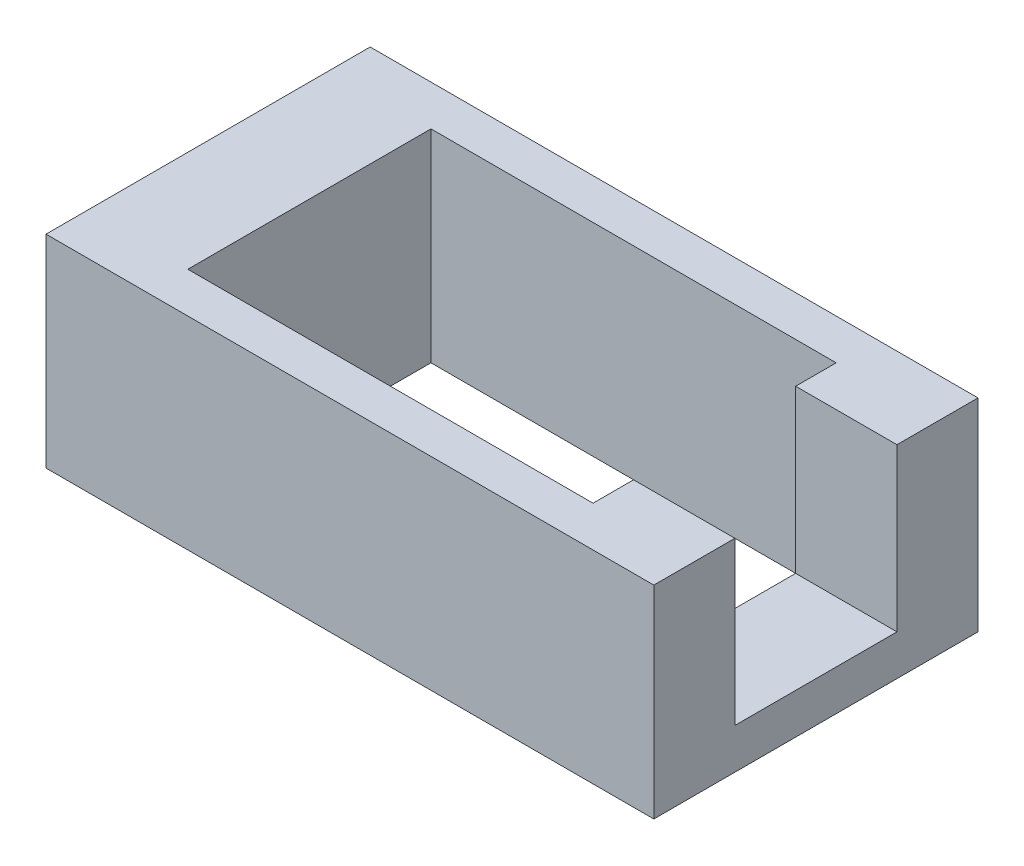
ISO-10303-21;
HEADER;
FILE_DESCRIPTION(('STEP AP214'),'2;1');
FILE_NAME('part.step','',(''),(''),'','','');
FILE_SCHEMA(('AUTOMOTIVE_DESIGN { 1 0 10303 214 1 1 1 1 }'));
ENDSEC;
DATA;
#1=APPLICATION_CONTEXT('core data for automotive mechanical design processes');
#2=APPLICATION_PROTOCOL_DEFINITION('international standard','automotive_design',2000,#1);
#3=PRODUCT_CONTEXT('',#1,'mechanical');
#4=PRODUCT('Part','Part','',(#3));
#5=PRODUCT_RELATED_PRODUCT_CATEGORY('part','',(#4));
#6=PRODUCT_DEFINITION_FORMATION('','',#4);
#7=PRODUCT_DEFINITION_CONTEXT('part definition',#1,'design');
#8=PRODUCT_DEFINITION('design','',#6,#7);
#9=PRODUCT_DEFINITION_SHAPE('','',#8);
#10=(LENGTH_UNIT() NAMED_UNIT(*) SI_UNIT(.MILLI.,.METRE.));
#11=(NAMED_UNIT(*) PLANE_ANGLE_UNIT() SI_UNIT($,.RADIAN.));
#12=(NAMED_UNIT(*) SI_UNIT($,.STERADIAN.) SOLID_ANGLE_UNIT());
#13=UNCERTAINTY_MEASURE_WITH_UNIT(LENGTH_MEASURE(1.E-05),#10,'distance_accuracy_value','');
#14=(GEOMETRIC_REPRESENTATION_CONTEXT(3) GLOBAL_UNCERTAINTY_ASSIGNED_CONTEXT((#13)) GLOBAL_UNIT_ASSIGNED_CONTEXT((#10,
#11,#12)) REPRESENTATION_CONTEXT('',''));
#15=CARTESIAN_POINT('',(0.,0.,0.));
#16=DIRECTION('',(0.,0.,1.));
#17=DIRECTION('',(1.,0.,0.));
#18=AXIS2_PLACEMENT_3D('',#15,#16,#17);
#19=CARTESIAN_POINT('',(0.,55.4278760968653,0.));
#20=DIRECTION('',(0.,1.,0.));
#21=DIRECTION('',(0.,0.,1.));
#22=AXIS2_PLACEMENT_3D('',#19,#20,#21);
#23=PLANE('',#22);
#24=DIRECTION('',(0.,0.,1.));
#25=VECTOR('',#24,1.);
#26=CARTESIAN_POINT('',(5.,55.4278760968653,-33.));
#27=LINE('',#26,#25);
#28=CARTESIAN_POINT('',(5.,55.4278760968653,-33.));
#29=VERTEX_POINT('',#28);
#30=CARTESIAN_POINT('',(5.,55.4278760968653,-32.));
#31=VERTEX_POINT('',#30);
#32=EDGE_CURVE('E242',#29,#31,#27,.T.);
#33=ORIENTED_EDGE('',*,*,#32,.T.);
#34=DIRECTION('',(1.,0.,0.));
#35=VECTOR('',#34,1.);
#36=CARTESIAN_POINT('',(2.5,55.4278760968653,-32.));
#37=LINE('',#36,#35);
#38=CARTESIAN_POINT('',(7.5,55.4278760968653,-32.));
#39=VERTEX_POINT('',#38);
#40=EDGE_CURVE('E47',#31,#39,#37,.T.);
#41=ORIENTED_EDGE('',*,*,#40,.T.);
#42=DIRECTION('',(0.,0.,1.));
#43=VECTOR('',#42,1.);
#44=CARTESIAN_POINT('',(7.5,55.4278760968653,-34.));
#45=LINE('',#44,#43);
#46=CARTESIAN_POINT('',(7.5,55.4278760968653,-34.));
#47=VERTEX_POINT('',#46);
#48=EDGE_CURVE('E243',#47,#39,#45,.T.);
#49=ORIENTED_EDGE('',*,*,#48,.F.);
#50=DIRECTION('',(1.,0.,0.));
#51=VECTOR('',#50,1.);
#52=CARTESIAN_POINT('',(-7.5,55.4278760968653,-34.));
#53=LINE('',#52,#51);
#54=CARTESIAN_POINT('',(-7.5,55.4278760968653,-34.));
#55=VERTEX_POINT('',#54);
#56=EDGE_CURVE('E235',#55,#47,#53,.T.);
#57=ORIENTED_EDGE('',*,*,#56,.F.);
#58=DIRECTION('',(0.,0.,-1.));
#59=VECTOR('',#58,1.);
#60=CARTESIAN_POINT('',(-7.5,55.4278760968653,-34.));
#61=LINE('',#60,#59);
#62=CARTESIAN_POINT('',(-7.5,55.4278760968653,-26.));
#63=VERTEX_POINT('',#62);
#64=EDGE_CURVE('E65',#63,#55,#61,.T.);
#65=ORIENTED_EDGE('',*,*,#64,.F.);
#66=DIRECTION('',(-1.,0.,0.));
#67=VECTOR('',#66,1.);
#68=CARTESIAN_POINT('',(-7.5,55.4278760968653,-26.));
#69=LINE('',#68,#67);
#70=CARTESIAN_POINT('',(7.5,55.4278760968653,-26.));
#71=VERTEX_POINT('',#70);
#72=EDGE_CURVE('E60',#71,#63,#69,.T.);
#73=ORIENTED_EDGE('',*,*,#72,.F.);
#74=CARTESIAN_POINT('',(7.5,55.4278760968653,-28.));
#75=VERTEX_POINT('',#74);
#76=EDGE_CURVE('E246',#75,#71,#45,.T.);
#77=ORIENTED_EDGE('',*,*,#76,.F.);
#78=DIRECTION('',(-1.,0.,0.));
#79=VECTOR('',#78,1.);
#80=CARTESIAN_POINT('',(2.5,55.4278760968653,-28.));
#81=LINE('',#80,#79);
#82=CARTESIAN_POINT('',(5.,55.4278760968653,-28.));
#83=VERTEX_POINT('',#82);
#84=EDGE_CURVE('E12',#75,#83,#81,.T.);
#85=ORIENTED_EDGE('',*,*,#84,.T.);
#86=CARTESIAN_POINT('',(5.,55.4278760968653,-27.));
#87=VERTEX_POINT('',#86);
#88=EDGE_CURVE('E237',#83,#87,#27,.T.);
#89=ORIENTED_EDGE('',*,*,#88,.T.);
#90=DIRECTION('',(-1.,0.,0.));
#91=VECTOR('',#90,1.);
#92=CARTESIAN_POINT('',(-5.,55.4278760968653,-27.));
#93=LINE('',#92,#91);
#94=CARTESIAN_POINT('',(-5.,55.4278760968653,-27.));
#95=VERTEX_POINT('',#94);
#96=EDGE_CURVE('E241',#87,#95,#93,.T.);
#97=ORIENTED_EDGE('',*,*,#96,.T.);
#98=DIRECTION('',(0.,0.,-1.));
#99=VECTOR('',#98,1.);
#100=CARTESIAN_POINT('',(-5.,55.4278760968653,-33.));
#101=LINE('',#100,#99);
#102=CARTESIAN_POINT('',(-5.,55.4278760968653,-33.));
#103=VERTEX_POINT('',#102);
#104=EDGE_CURVE('E250',#95,#103,#101,.T.);
#105=ORIENTED_EDGE('',*,*,#104,.T.);
#106=DIRECTION('',(1.,0.,0.));
#107=VECTOR('',#106,1.);
#108=CARTESIAN_POINT('',(-5.,55.4278760968653,-33.));
#109=LINE('',#108,#107);
#110=EDGE_CURVE('E256',#103,#29,#109,.T.);
#111=ORIENTED_EDGE('',*,*,#110,.T.);
#112=EDGE_LOOP('',(#33,#41,#49,#57,#65,#73,#77,#85,#89,#97,#105,#111));
#113=FACE_BOUND('',#112,.T.);
#114=ADVANCED_FACE('F44',(#113),#23,.T.);
#115=CARTESIAN_POINT('',(-7.5,50.4278760968653,-26.));
#116=DIRECTION('',(0.,0.,1.));
#117=DIRECTION('',(1.,0.,0.));
#118=AXIS2_PLACEMENT_3D('',#115,#116,#117);
#119=PLANE('',#118);
#120=DIRECTION('',(0.,1.,0.));
#121=VECTOR('',#120,1.);
#122=CARTESIAN_POINT('',(7.5,50.4278760968653,-26.));
#123=LINE('',#122,#121);
#124=CARTESIAN_POINT('',(7.5,50.4278760968653,-26.));
#125=VERTEX_POINT('',#124);
#126=EDGE_CURVE('E197',#125,#71,#123,.T.);
#127=ORIENTED_EDGE('',*,*,#126,.T.);
#128=ORIENTED_EDGE('',*,*,#72,.T.);
#129=DIRECTION('',(0.,1.,0.));
#130=VECTOR('',#129,1.);
#131=CARTESIAN_POINT('',(-7.5,50.4278760968653,-26.));
#132=LINE('',#131,#130);
#133=CARTESIAN_POINT('',(-7.5,50.4278760968653,-26.));
#134=VERTEX_POINT('',#133);
#135=EDGE_CURVE('E202',#134,#63,#132,.T.);
#136=ORIENTED_EDGE('',*,*,#135,.F.);
#137=DIRECTION('',(1.,0.,0.));
#138=VECTOR('',#137,1.);
#139=CARTESIAN_POINT('',(-7.5,50.4278760968653,-26.));
#140=LINE('',#139,#138);
#141=EDGE_CURVE('E192',#134,#125,#140,.T.);
#142=ORIENTED_EDGE('',*,*,#141,.T.);
#143=EDGE_LOOP('',(#127,#128,#136,#142));
#144=FACE_BOUND('',#143,.T.);
#145=ADVANCED_FACE('F272',(#144),#119,.T.);
#146=CARTESIAN_POINT('',(-5.,48.4278760968653,-27.));
#147=DIRECTION('',(0.,0.,1.));
#148=DIRECTION('',(1.,0.,0.));
#149=AXIS2_PLACEMENT_3D('',#146,#147,#148);
#150=PLANE('',#149);
#151=ORIENTED_EDGE('',*,*,#96,.F.);
#152=DIRECTION('',(0.,1.,0.));
#153=VECTOR('',#152,1.);
#154=CARTESIAN_POINT('',(5.,48.4278760968653,-27.));
#155=LINE('',#154,#153);
#156=CARTESIAN_POINT('',(5.,50.4278760968653,-27.));
#157=VERTEX_POINT('',#156);
#158=EDGE_CURVE('E165',#157,#87,#155,.T.);
#159=ORIENTED_EDGE('',*,*,#158,.F.);
#160=DIRECTION('',(1.,0.,0.));
#161=VECTOR('',#160,1.);
#162=CARTESIAN_POINT('',(0.,50.4278760968653,-27.));
#163=LINE('',#162,#161);
#164=CARTESIAN_POINT('',(-5.,50.4278760968653,-27.));
#165=VERTEX_POINT('',#164);
#166=EDGE_CURVE('E219',#165,#157,#163,.T.);
#167=ORIENTED_EDGE('',*,*,#166,.F.);
#168=DIRECTION('',(0.,1.,0.));
#169=VECTOR('',#168,1.);
#170=CARTESIAN_POINT('',(-5.,48.4278760968653,-27.));
#171=LINE('',#170,#169);
#172=EDGE_CURVE('E170',#165,#95,#171,.T.);
#173=ORIENTED_EDGE('',*,*,#172,.T.);
#174=EDGE_LOOP('',(#151,#159,#167,#173));
#175=FACE_BOUND('',#174,.T.);
#176=ADVANCED_FACE('F292',(#175),#150,.F.);
#177=CARTESIAN_POINT('',(5.,48.4278760968653,-33.));
#178=DIRECTION('',(1.,0.,0.));
#179=DIRECTION('',(0.,0.,-1.));
#180=AXIS2_PLACEMENT_3D('',#177,#178,#179);
#181=PLANE('',#180);
#182=ORIENTED_EDGE('',*,*,#32,.F.);
#183=DIRECTION('',(0.,1.,0.));
#184=VECTOR('',#183,1.);
#185=CARTESIAN_POINT('',(5.,48.4278760968653,-33.));
#186=LINE('',#185,#184);
#187=CARTESIAN_POINT('',(5.,50.4278760968653,-33.));
#188=VERTEX_POINT('',#187);
#189=EDGE_CURVE('E163',#188,#29,#186,.T.);
#190=ORIENTED_EDGE('',*,*,#189,.F.);
#191=DIRECTION('',(0.,0.,-1.));
#192=VECTOR('',#191,1.);
#193=CARTESIAN_POINT('',(5.00000000000001,50.4278760968653,0.));
#194=LINE('',#193,#192);
#195=EDGE_CURVE('E223',#157,#188,#194,.T.);
#196=ORIENTED_EDGE('',*,*,#195,.F.);
#197=ORIENTED_EDGE('',*,*,#158,.T.);
#198=ORIENTED_EDGE('',*,*,#88,.F.);
#199=DIRECTION('',(0.,-1.,0.));
#200=VECTOR('',#199,1.);
#201=CARTESIAN_POINT('',(5.,48.4278760968653,-28.));
#202=LINE('',#201,#200);
#203=CARTESIAN_POINT('',(5.,51.4278760968654,-28.));
#204=VERTEX_POINT('',#203);
#205=EDGE_CURVE('E227',#83,#204,#202,.T.);
#206=ORIENTED_EDGE('',*,*,#205,.T.);
#207=DIRECTION('',(0.,0.,-1.));
#208=VECTOR('',#207,1.);
#209=CARTESIAN_POINT('',(5.,51.4278760968654,-33.));
#210=LINE('',#209,#208);
#211=CARTESIAN_POINT('',(5.,51.4278760968654,-32.));
#212=VERTEX_POINT('',#211);
#213=EDGE_CURVE('E150',#204,#212,#210,.T.);
#214=ORIENTED_EDGE('',*,*,#213,.T.);
#215=DIRECTION('',(0.,1.,0.));
#216=VECTOR('',#215,1.);
#217=CARTESIAN_POINT('',(5.,48.4278760968653,-32.));
#218=LINE('',#217,#216);
#219=EDGE_CURVE('E232',#212,#31,#218,.T.);
#220=ORIENTED_EDGE('',*,*,#219,.T.);
#221=EDGE_LOOP('',(#182,#190,#196,#197,#198,#206,#214,#220));
#222=FACE_BOUND('',#221,.T.);
#223=ADVANCED_FACE('F296',(#222),#181,.F.);
#224=CARTESIAN_POINT('',(2.5,51.4278760968654,-28.));
#225=DIRECTION('',(0.,-1.,0.));
#226=DIRECTION('',(0.,0.,-1.));
#227=AXIS2_PLACEMENT_3D('',#224,#225,#226);
#228=PLANE('',#227);
#229=DIRECTION('',(1.,0.,0.));
#230=VECTOR('',#229,1.);
#231=CARTESIAN_POINT('',(2.5,51.4278760968654,-28.));
#232=LINE('',#231,#230);
#233=CARTESIAN_POINT('',(7.5,51.4278760968654,-28.));
#234=VERTEX_POINT('',#233);
#235=EDGE_CURVE('E136',#204,#234,#232,.T.);
#236=ORIENTED_EDGE('',*,*,#235,.T.);
#237=DIRECTION('',(0.,0.,-1.));
#238=VECTOR('',#237,1.);
#239=CARTESIAN_POINT('',(7.5,51.4278760968654,-28.));
#240=LINE('',#239,#238);
#241=CARTESIAN_POINT('',(7.5,51.4278760968654,-32.));
#242=VERTEX_POINT('',#241);
#243=EDGE_CURVE('E140',#234,#242,#240,.T.);
#244=ORIENTED_EDGE('',*,*,#243,.T.);
#245=DIRECTION('',(1.,0.,0.));
#246=VECTOR('',#245,1.);
#247=CARTESIAN_POINT('',(2.5,51.4278760968654,-32.));
#248=LINE('',#247,#246);
#249=EDGE_CURVE('E152',#212,#242,#248,.T.);
#250=ORIENTED_EDGE('',*,*,#249,.F.);
#251=ORIENTED_EDGE('',*,*,#213,.F.);
#252=EDGE_LOOP('',(#236,#244,#250,#251));
#253=FACE_BOUND('',#252,.T.);
#254=ADVANCED_FACE('F146',(#253),#228,.F.);
#255=CARTESIAN_POINT('',(7.5,50.4278760968653,-34.));
#256=DIRECTION('',(1.,0.,0.));
#257=DIRECTION('',(0.,0.,-1.));
#258=AXIS2_PLACEMENT_3D('',#255,#256,#257);
#259=PLANE('',#258);
#260=DIRECTION('',(0.,1.,0.));
#261=VECTOR('',#260,1.);
#262=CARTESIAN_POINT('',(7.5,50.4278760968653,-34.));
#263=LINE('',#262,#261);
#264=CARTESIAN_POINT('',(7.5,50.4278760968653,-34.));
#265=VERTEX_POINT('',#264);
#266=EDGE_CURVE('E196',#265,#47,#263,.T.);
#267=ORIENTED_EDGE('',*,*,#266,.T.);
#268=ORIENTED_EDGE('',*,*,#48,.T.);
#269=DIRECTION('',(0.,1.,0.));
#270=VECTOR('',#269,1.);
#271=CARTESIAN_POINT('',(7.5,56.4278760968654,-32.));
#272=LINE('',#271,#270);
#273=EDGE_CURVE('E141',#242,#39,#272,.T.);
#274=ORIENTED_EDGE('',*,*,#273,.F.);
#275=ORIENTED_EDGE('',*,*,#243,.F.);
#276=DIRECTION('',(0.,-1.,0.));
#277=VECTOR('',#276,1.);
#278=CARTESIAN_POINT('',(7.5,56.4278760968654,-28.));
#279=LINE('',#278,#277);
#280=EDGE_CURVE('E132',#75,#234,#279,.T.);
#281=ORIENTED_EDGE('',*,*,#280,.F.);
#282=ORIENTED_EDGE('',*,*,#76,.T.);
#283=ORIENTED_EDGE('',*,*,#126,.F.);
#284=DIRECTION('',(0.,0.,-1.));
#285=VECTOR('',#284,1.);
#286=CARTESIAN_POINT('',(7.5,50.4278760968653,-34.));
#287=LINE('',#286,#285);
#288=EDGE_CURVE('E169',#125,#265,#287,.T.);
#289=ORIENTED_EDGE('',*,*,#288,.T.);
#290=EDGE_LOOP('',(#267,#268,#274,#275,#281,#282,#283,#289));
#291=FACE_BOUND('',#290,.T.);
#292=ADVANCED_FACE('F155',(#291),#259,.T.);
#293=CARTESIAN_POINT('',(2.5,56.4278760968654,-28.));
#294=DIRECTION('',(0.,0.,1.));
#295=DIRECTION('',(1.,0.,0.));
#296=AXIS2_PLACEMENT_3D('',#293,#294,#295);
#297=PLANE('',#296);
#298=ORIENTED_EDGE('',*,*,#84,.F.);
#299=ORIENTED_EDGE('',*,*,#280,.T.);
#300=ORIENTED_EDGE('',*,*,#235,.F.);
#301=ORIENTED_EDGE('',*,*,#205,.F.);
#302=EDGE_LOOP('',(#298,#299,#300,#301));
#303=FACE_BOUND('',#302,.T.);
#304=ADVANCED_FACE('F134',(#303),#297,.F.);
#305=CARTESIAN_POINT('',(2.5,56.4278760968654,-32.));
#306=DIRECTION('',(0.,0.,-1.));
#307=DIRECTION('',(-1.,0.,0.));
#308=AXIS2_PLACEMENT_3D('',#305,#306,#307);
#309=PLANE('',#308);
#310=ORIENTED_EDGE('',*,*,#40,.F.);
#311=ORIENTED_EDGE('',*,*,#219,.F.);
#312=ORIENTED_EDGE('',*,*,#249,.T.);
#313=ORIENTED_EDGE('',*,*,#273,.T.);
#314=EDGE_LOOP('',(#310,#311,#312,#313));
#315=FACE_BOUND('',#314,.T.);
#316=ADVANCED_FACE('F302',(#315),#309,.F.);
#317=CARTESIAN_POINT('',(0.,50.4278760968653,0.));
#318=DIRECTION('',(0.,1.,0.));
#319=DIRECTION('',(0.,0.,1.));
#320=AXIS2_PLACEMENT_3D('',#317,#318,#319);
#321=PLANE('',#320);
#322=ORIENTED_EDGE('',*,*,#166,.T.);
#323=ORIENTED_EDGE('',*,*,#195,.T.);
#324=DIRECTION('',(-1.,0.,0.));
#325=VECTOR('',#324,1.);
#326=CARTESIAN_POINT('',(0.,50.4278760968653,-33.));
#327=LINE('',#326,#325);
#328=CARTESIAN_POINT('',(-5.,50.4278760968653,-33.));
#329=VERTEX_POINT('',#328);
#330=EDGE_CURVE('E201',#188,#329,#327,.T.);
#331=ORIENTED_EDGE('',*,*,#330,.T.);
#332=DIRECTION('',(0.,0.,1.));
#333=VECTOR('',#332,1.);
#334=CARTESIAN_POINT('',(-4.99999999999999,50.4278760968653,0.));
#335=LINE('',#334,#333);
#336=EDGE_CURVE('E215',#329,#165,#335,.T.);
#337=ORIENTED_EDGE('',*,*,#336,.T.);
#338=EDGE_LOOP('',(#322,#323,#331,#337));
#339=FACE_BOUND('',#338,.T.);
#340=ORIENTED_EDGE('',*,*,#288,.F.);
#341=ORIENTED_EDGE('',*,*,#141,.F.);
#342=DIRECTION('',(0.,0.,1.));
#343=VECTOR('',#342,1.);
#344=CARTESIAN_POINT('',(-7.5,50.4278760968653,-34.));
#345=LINE('',#344,#343);
#346=CARTESIAN_POINT('',(-7.5,50.4278760968653,-34.));
#347=VERTEX_POINT('',#346);
#348=EDGE_CURVE('E188',#347,#134,#345,.T.);
#349=ORIENTED_EDGE('',*,*,#348,.F.);
#350=DIRECTION('',(-1.,0.,0.));
#351=VECTOR('',#350,1.);
#352=CARTESIAN_POINT('',(-7.5,50.4278760968653,-34.));
#353=LINE('',#352,#351);
#354=EDGE_CURVE('E184',#265,#347,#353,.T.);
#355=ORIENTED_EDGE('',*,*,#354,.F.);
#356=EDGE_LOOP('',(#340,#341,#349,#355));
#357=FACE_BOUND('',#356,.T.);
#358=ADVANCED_FACE('F269',(#339,#357),#321,.F.);
#359=CARTESIAN_POINT('',(-5.,48.4278760968653,-33.));
#360=DIRECTION('',(-1.,0.,0.));
#361=DIRECTION('',(0.,0.,1.));
#362=AXIS2_PLACEMENT_3D('',#359,#360,#361);
#363=PLANE('',#362);
#364=ORIENTED_EDGE('',*,*,#104,.F.);
#365=ORIENTED_EDGE('',*,*,#172,.F.);
#366=ORIENTED_EDGE('',*,*,#336,.F.);
#367=DIRECTION('',(0.,1.,0.));
#368=VECTOR('',#367,1.);
#369=CARTESIAN_POINT('',(-5.,48.4278760968653,-33.));
#370=LINE('',#369,#368);
#371=EDGE_CURVE('E174',#329,#103,#370,.T.);
#372=ORIENTED_EDGE('',*,*,#371,.T.);
#373=EDGE_LOOP('',(#364,#365,#366,#372));
#374=FACE_BOUND('',#373,.T.);
#375=ADVANCED_FACE('F283',(#374),#363,.F.);
#376=CARTESIAN_POINT('',(-5.,48.4278760968653,-33.));
#377=DIRECTION('',(0.,0.,-1.));
#378=DIRECTION('',(-1.,0.,0.));
#379=AXIS2_PLACEMENT_3D('',#376,#377,#378);
#380=PLANE('',#379);
#381=ORIENTED_EDGE('',*,*,#110,.F.);
#382=ORIENTED_EDGE('',*,*,#371,.F.);
#383=ORIENTED_EDGE('',*,*,#330,.F.);
#384=ORIENTED_EDGE('',*,*,#189,.T.);
#385=EDGE_LOOP('',(#381,#382,#383,#384));
#386=FACE_BOUND('',#385,.T.);
#387=ADVANCED_FACE('F276',(#386),#380,.F.);
#388=CARTESIAN_POINT('',(-7.5,50.4278760968653,-34.));
#389=DIRECTION('',(-1.,0.,0.));
#390=DIRECTION('',(0.,0.,1.));
#391=AXIS2_PLACEMENT_3D('',#388,#389,#390);
#392=PLANE('',#391);
#393=ORIENTED_EDGE('',*,*,#135,.T.);
#394=ORIENTED_EDGE('',*,*,#64,.T.);
#395=DIRECTION('',(0.,1.,0.));
#396=VECTOR('',#395,1.);
#397=CARTESIAN_POINT('',(-7.5,50.4278760968653,-34.));
#398=LINE('',#397,#396);
#399=EDGE_CURVE('E206',#347,#55,#398,.T.);
#400=ORIENTED_EDGE('',*,*,#399,.F.);
#401=ORIENTED_EDGE('',*,*,#348,.T.);
#402=EDGE_LOOP('',(#393,#394,#400,#401));
#403=FACE_BOUND('',#402,.T.);
#404=ADVANCED_FACE('F274',(#403),#392,.T.);
#405=CARTESIAN_POINT('',(-7.5,50.4278760968653,-34.));
#406=DIRECTION('',(0.,0.,-1.));
#407=DIRECTION('',(-1.,0.,0.));
#408=AXIS2_PLACEMENT_3D('',#405,#406,#407);
#409=PLANE('',#408);
#410=ORIENTED_EDGE('',*,*,#399,.T.);
#411=ORIENTED_EDGE('',*,*,#56,.T.);
#412=ORIENTED_EDGE('',*,*,#266,.F.);
#413=ORIENTED_EDGE('',*,*,#354,.T.);
#414=EDGE_LOOP('',(#410,#411,#412,#413));
#415=FACE_BOUND('',#414,.T.);
#416=ADVANCED_FACE('F263',(#415),#409,.T.);
#417=CLOSED_SHELL('',(#114,#145,#176,#223,#254,#292,#304,#316,#358,#375,#387,#404,#416));
#418=MANIFOLD_SOLID_BREP('B2',#417);
#419=ADVANCED_BREP_SHAPE_REPRESENTATION('',(#18,#418),#14);
#420=SHAPE_DEFINITION_REPRESENTATION(#9,#419);
ENDSEC;
END-ISO-10303-21;
